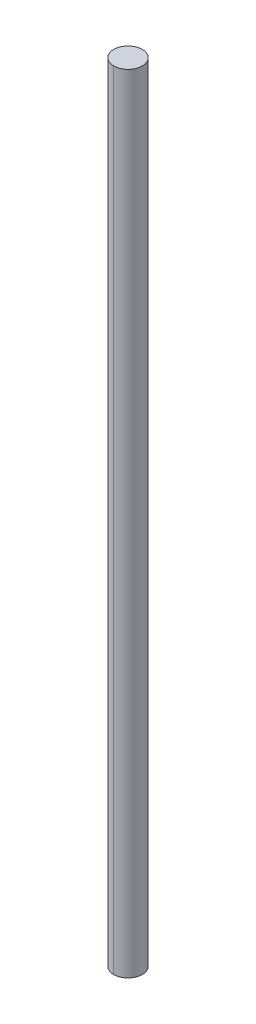
ISO-10303-21;
HEADER;
FILE_DESCRIPTION(('STEP AP214'),'2;1');
FILE_NAME('part.step','',(''),(''),'','','');
FILE_SCHEMA(('AUTOMOTIVE_DESIGN { 1 0 10303 214 1 1 1 1 }'));
ENDSEC;
DATA;
#1=APPLICATION_CONTEXT('core data for automotive mechanical design processes');
#2=APPLICATION_PROTOCOL_DEFINITION('international standard','automotive_design',2000,#1);
#3=PRODUCT_CONTEXT('',#1,'mechanical');
#4=PRODUCT('Part','Part','',(#3));
#5=PRODUCT_RELATED_PRODUCT_CATEGORY('part','',(#4));
#6=PRODUCT_DEFINITION_FORMATION('','',#4);
#7=PRODUCT_DEFINITION_CONTEXT('part definition',#1,'design');
#8=PRODUCT_DEFINITION('design','',#6,#7);
#9=PRODUCT_DEFINITION_SHAPE('','',#8);
#10=(LENGTH_UNIT() NAMED_UNIT(*) SI_UNIT(.MILLI.,.METRE.));
#11=(NAMED_UNIT(*) PLANE_ANGLE_UNIT() SI_UNIT($,.RADIAN.));
#12=(NAMED_UNIT(*) SI_UNIT($,.STERADIAN.) SOLID_ANGLE_UNIT());
#13=UNCERTAINTY_MEASURE_WITH_UNIT(LENGTH_MEASURE(1.E-05),#10,'distance_accuracy_value','');
#14=(GEOMETRIC_REPRESENTATION_CONTEXT(3) GLOBAL_UNCERTAINTY_ASSIGNED_CONTEXT((#13)) GLOBAL_UNIT_ASSIGNED_CONTEXT((#10,
#11,#12)) REPRESENTATION_CONTEXT('',''));
#15=CARTESIAN_POINT('',(0.,0.,0.));
#16=DIRECTION('',(0.,0.,1.));
#17=DIRECTION('',(1.,0.,0.));
#18=AXIS2_PLACEMENT_3D('',#15,#16,#17);
#19=CARTESIAN_POINT('',(2.1717,0.,0.));
#20=DIRECTION('',(0.,1.,0.));
#21=DIRECTION('',(1.,0.,0.));
#22=AXIS2_PLACEMENT_3D('',#19,#20,#21);
#23=PLANE('',#22);
#24=CARTESIAN_POINT('',(2.1717,0.,0.));
#25=DIRECTION('',(0.,1.,0.));
#26=DIRECTION('',(0.,0.,1.));
#27=AXIS2_PLACEMENT_3D('',#24,#25,#26);
#28=CIRCLE('',#27,1.1557);
#29=CARTESIAN_POINT('',(2.1717,0.,-1.1557));
#30=VERTEX_POINT('',#29);
#31=CARTESIAN_POINT('',(2.1717,0.,1.1557));
#32=VERTEX_POINT('',#31);
#33=EDGE_CURVE('E11',#30,#32,#28,.T.);
#34=ORIENTED_EDGE('',*,*,#33,.F.);
#35=CARTESIAN_POINT('',(2.1717,0.,0.));
#36=DIRECTION('',(0.,1.,0.));
#37=DIRECTION('',(0.,0.,1.));
#38=AXIS2_PLACEMENT_3D('',#35,#36,#37);
#39=CIRCLE('',#38,1.1557);
#40=EDGE_CURVE('E83',#32,#30,#39,.T.);
#41=ORIENTED_EDGE('',*,*,#40,.F.);
#42=EDGE_LOOP('',(#34,#41));
#43=FACE_BOUND('',#42,.T.);
#44=ADVANCED_FACE('F38',(#43),#23,.F.);
#45=CARTESIAN_POINT('',(2.1717,63.5,0.));
#46=DIRECTION('',(0.,1.,0.));
#47=DIRECTION('',(1.,0.,0.));
#48=AXIS2_PLACEMENT_3D('',#45,#46,#47);
#49=PLANE('',#48);
#50=CARTESIAN_POINT('',(2.1717,63.5,0.));
#51=DIRECTION('',(0.,1.,0.));
#52=DIRECTION('',(0.,0.,1.));
#53=AXIS2_PLACEMENT_3D('',#50,#51,#52);
#54=CIRCLE('',#53,1.1557);
#55=CARTESIAN_POINT('',(2.1717,63.5,-1.1557));
#56=VERTEX_POINT('',#55);
#57=CARTESIAN_POINT('',(2.1717,63.5,1.1557));
#58=VERTEX_POINT('',#57);
#59=EDGE_CURVE('E49',#56,#58,#54,.T.);
#60=ORIENTED_EDGE('',*,*,#59,.T.);
#61=CARTESIAN_POINT('',(2.1717,63.5,0.));
#62=DIRECTION('',(0.,1.,0.));
#63=DIRECTION('',(0.,0.,1.));
#64=AXIS2_PLACEMENT_3D('',#61,#62,#63);
#65=CIRCLE('',#64,1.1557);
#66=EDGE_CURVE('E73',#58,#56,#65,.T.);
#67=ORIENTED_EDGE('',*,*,#66,.T.);
#68=EDGE_LOOP('',(#60,#67));
#69=FACE_BOUND('',#68,.T.);
#70=ADVANCED_FACE('F71',(#69),#49,.T.);
#71=CARTESIAN_POINT('',(2.1717,63.5,0.));
#72=DIRECTION('',(0.,-1.,0.));
#73=DIRECTION('',(0.,0.,-1.));
#74=AXIS2_PLACEMENT_3D('',#71,#72,#73);
#75=CYLINDRICAL_SURFACE('',#74,1.1557);
#76=DIRECTION('',(0.,-1.,0.));
#77=VECTOR('',#76,1.);
#78=CARTESIAN_POINT('',(2.1717,63.5,1.1557));
#79=LINE('',#78,#77);
#80=EDGE_CURVE('E42',#58,#32,#79,.T.);
#81=ORIENTED_EDGE('',*,*,#80,.F.);
#82=ORIENTED_EDGE('',*,*,#59,.F.);
#83=DIRECTION('',(0.,-1.,0.));
#84=VECTOR('',#83,1.);
#85=CARTESIAN_POINT('',(2.1717,63.5,-1.1557));
#86=LINE('',#85,#84);
#87=EDGE_CURVE('E77',#56,#30,#86,.T.);
#88=ORIENTED_EDGE('',*,*,#87,.T.);
#89=ORIENTED_EDGE('',*,*,#33,.T.);
#90=EDGE_LOOP('',(#81,#82,#88,#89));
#91=FACE_BOUND('',#90,.T.);
#92=ADVANCED_FACE('F40',(#91),#75,.T.);
#93=CARTESIAN_POINT('',(2.1717,63.5,0.));
#94=DIRECTION('',(0.,-1.,0.));
#95=DIRECTION('',(0.,0.,-1.));
#96=AXIS2_PLACEMENT_3D('',#93,#94,#95);
#97=CYLINDRICAL_SURFACE('',#96,1.1557);
#98=ORIENTED_EDGE('',*,*,#66,.F.);
#99=ORIENTED_EDGE('',*,*,#80,.T.);
#100=ORIENTED_EDGE('',*,*,#40,.T.);
#101=ORIENTED_EDGE('',*,*,#87,.F.);
#102=EDGE_LOOP('',(#98,#99,#100,#101));
#103=FACE_BOUND('',#102,.T.);
#104=ADVANCED_FACE('F84',(#103),#97,.T.);
#105=CLOSED_SHELL('',(#44,#70,#92,#104));
#106=MANIFOLD_SOLID_BREP('B2',#105);
#107=ADVANCED_BREP_SHAPE_REPRESENTATION('',(#18,#106),#14);
#108=SHAPE_DEFINITION_REPRESENTATION(#9,#107);
ENDSEC;
END-ISO-10303-21;
